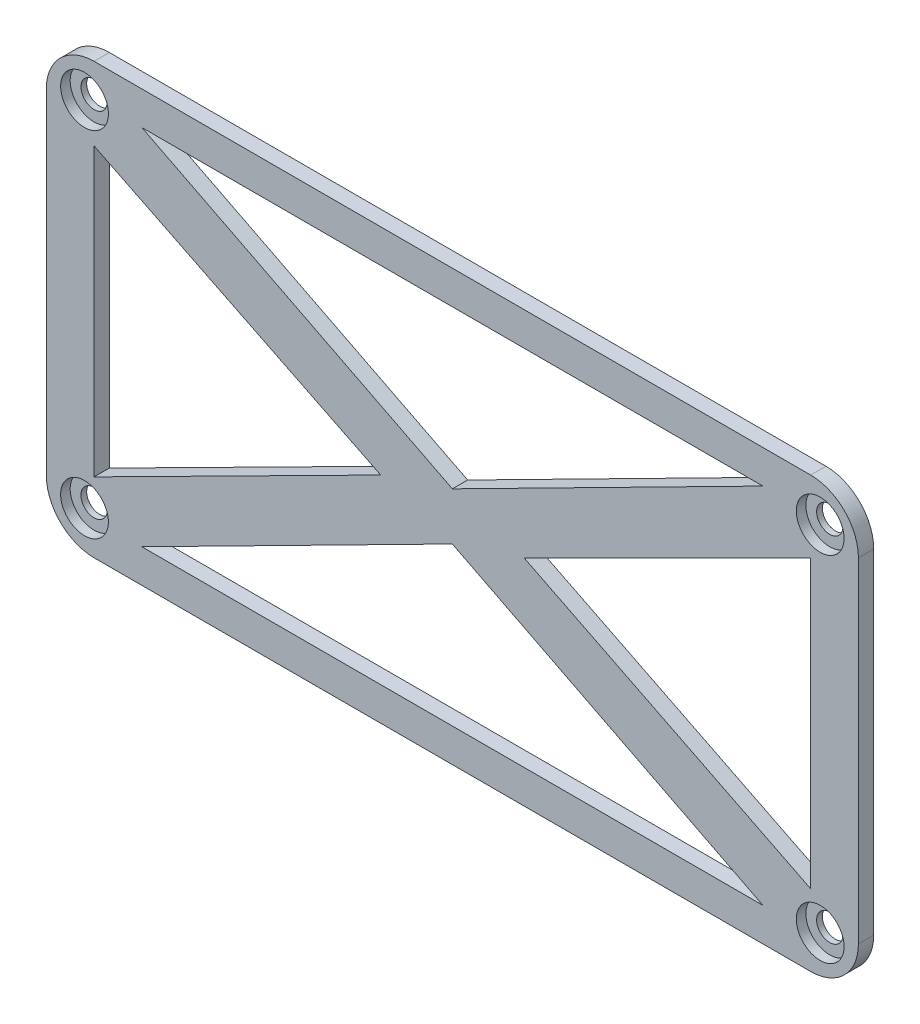
ISO-10303-21;
HEADER;
FILE_DESCRIPTION(('STEP AP214'),'2;1');
FILE_NAME('part.step','',(''),(''),'','','');
FILE_SCHEMA(('AUTOMOTIVE_DESIGN { 1 0 10303 214 1 1 1 1 }'));
ENDSEC;
DATA;
#1=APPLICATION_CONTEXT('core data for automotive mechanical design processes');
#2=APPLICATION_PROTOCOL_DEFINITION('international standard','automotive_design',2000,#1);
#3=PRODUCT_CONTEXT('',#1,'mechanical');
#4=PRODUCT('Part','Part','',(#3));
#5=PRODUCT_RELATED_PRODUCT_CATEGORY('part','',(#4));
#6=PRODUCT_DEFINITION_FORMATION('','',#4);
#7=PRODUCT_DEFINITION_CONTEXT('part definition',#1,'design');
#8=PRODUCT_DEFINITION('design','',#6,#7);
#9=PRODUCT_DEFINITION_SHAPE('','',#8);
#10=(LENGTH_UNIT() NAMED_UNIT(*) SI_UNIT(.MILLI.,.METRE.));
#11=(NAMED_UNIT(*) PLANE_ANGLE_UNIT() SI_UNIT($,.RADIAN.));
#12=(NAMED_UNIT(*) SI_UNIT($,.STERADIAN.) SOLID_ANGLE_UNIT());
#13=UNCERTAINTY_MEASURE_WITH_UNIT(LENGTH_MEASURE(1.E-05),#10,'distance_accuracy_value','');
#14=(GEOMETRIC_REPRESENTATION_CONTEXT(3) GLOBAL_UNCERTAINTY_ASSIGNED_CONTEXT((#13)) GLOBAL_UNIT_ASSIGNED_CONTEXT((#10,
#11,#12)) REPRESENTATION_CONTEXT('',''));
#15=CARTESIAN_POINT('',(0.,0.,0.));
#16=DIRECTION('',(0.,0.,1.));
#17=DIRECTION('',(1.,0.,0.));
#18=AXIS2_PLACEMENT_3D('',#15,#16,#17);
#19=CARTESIAN_POINT('',(-74.5741165309511,37.4873903075342,42.2));
#20=DIRECTION('',(0.,0.,-1.));
#21=DIRECTION('',(-1.,0.,0.));
#22=AXIS2_PLACEMENT_3D('',#19,#20,#21);
#23=CYLINDRICAL_SURFACE('',#22,2.75000000000001);
#24=CARTESIAN_POINT('',(-74.5741165309511,37.4873903075342,0.));
#25=DIRECTION('',(0.,0.,1.));
#26=DIRECTION('',(1.,0.,0.));
#27=AXIS2_PLACEMENT_3D('',#24,#25,#26);
#28=CIRCLE('',#27,2.75000000000001);
#29=CARTESIAN_POINT('',(-71.8241165309511,37.4873903075342,0.));
#30=VERTEX_POINT('',#29);
#31=EDGE_CURVE('E306',#30,#30,#28,.F.);
#32=ORIENTED_EDGE('',*,*,#31,.T.);
#33=EDGE_LOOP('',(#32));
#34=FACE_BOUND('',#33,.T.);
#35=CARTESIAN_POINT('',(-74.5741165309511,37.4873903075342,1.2));
#36=DIRECTION('',(0.,0.,1.));
#37=DIRECTION('',(1.,0.,0.));
#38=AXIS2_PLACEMENT_3D('',#35,#36,#37);
#39=CIRCLE('',#38,2.75000000000001);
#40=CARTESIAN_POINT('',(-71.8241165309511,37.4873903075342,1.2));
#41=VERTEX_POINT('',#40);
#42=EDGE_CURVE('E43',#41,#41,#39,.T.);
#43=ORIENTED_EDGE('',*,*,#42,.T.);
#44=EDGE_LOOP('',(#43));
#45=FACE_BOUND('',#44,.T.);
#46=ADVANCED_FACE('F39',(#34,#45),#23,.F.);
#47=CARTESIAN_POINT('',(-74.5741165309511,-36.5126096924658,42.2));
#48=DIRECTION('',(0.,0.,-1.));
#49=DIRECTION('',(-1.,0.,0.));
#50=AXIS2_PLACEMENT_3D('',#47,#48,#49);
#51=CYLINDRICAL_SURFACE('',#50,2.75000000000001);
#52=CARTESIAN_POINT('',(-74.5741165309511,-36.5126096924658,0.));
#53=DIRECTION('',(0.,0.,1.));
#54=DIRECTION('',(1.,0.,0.));
#55=AXIS2_PLACEMENT_3D('',#52,#53,#54);
#56=CIRCLE('',#55,2.75000000000001);
#57=CARTESIAN_POINT('',(-71.8241165309511,-36.5126096924658,0.));
#58=VERTEX_POINT('',#57);
#59=EDGE_CURVE('E233',#58,#58,#56,.F.);
#60=ORIENTED_EDGE('',*,*,#59,.T.);
#61=EDGE_LOOP('',(#60));
#62=FACE_BOUND('',#61,.T.);
#63=CARTESIAN_POINT('',(-74.5741165309511,-36.5126096924658,1.2));
#64=DIRECTION('',(0.,0.,1.));
#65=DIRECTION('',(1.,0.,0.));
#66=AXIS2_PLACEMENT_3D('',#63,#64,#65);
#67=CIRCLE('',#66,2.75000000000001);
#68=CARTESIAN_POINT('',(-71.8241165309511,-36.5126096924658,1.2));
#69=VERTEX_POINT('',#68);
#70=EDGE_CURVE('E259',#69,#69,#67,.T.);
#71=ORIENTED_EDGE('',*,*,#70,.T.);
#72=EDGE_LOOP('',(#71));
#73=FACE_BOUND('',#72,.T.);
#74=ADVANCED_FACE('F489',(#62,#73),#51,.F.);
#75=CARTESIAN_POINT('',(79.4258834690489,37.4873903075342,42.2));
#76=DIRECTION('',(0.,0.,-1.));
#77=DIRECTION('',(-1.,0.,0.));
#78=AXIS2_PLACEMENT_3D('',#75,#76,#77);
#79=CYLINDRICAL_SURFACE('',#78,2.75000000000001);
#80=CARTESIAN_POINT('',(79.4258834690489,37.4873903075342,0.));
#81=DIRECTION('',(0.,0.,1.));
#82=DIRECTION('',(1.,0.,0.));
#83=AXIS2_PLACEMENT_3D('',#80,#81,#82);
#84=CIRCLE('',#83,2.75000000000001);
#85=CARTESIAN_POINT('',(82.1758834690489,37.4873903075342,0.));
#86=VERTEX_POINT('',#85);
#87=EDGE_CURVE('E237',#86,#86,#84,.F.);
#88=ORIENTED_EDGE('',*,*,#87,.T.);
#89=EDGE_LOOP('',(#88));
#90=FACE_BOUND('',#89,.T.);
#91=CARTESIAN_POINT('',(79.4258834690489,37.4873903075342,1.2));
#92=DIRECTION('',(0.,0.,1.));
#93=DIRECTION('',(1.,0.,0.));
#94=AXIS2_PLACEMENT_3D('',#91,#92,#93);
#95=CIRCLE('',#94,2.75000000000001);
#96=CARTESIAN_POINT('',(82.1758834690489,37.4873903075342,1.2));
#97=VERTEX_POINT('',#96);
#98=EDGE_CURVE('E255',#97,#97,#95,.T.);
#99=ORIENTED_EDGE('',*,*,#98,.T.);
#100=EDGE_LOOP('',(#99));
#101=FACE_BOUND('',#100,.T.);
#102=ADVANCED_FACE('F493',(#90,#101),#79,.F.);
#103=CARTESIAN_POINT('',(79.4258834690489,-36.5126096924658,42.2));
#104=DIRECTION('',(0.,0.,-1.));
#105=DIRECTION('',(-1.,0.,0.));
#106=AXIS2_PLACEMENT_3D('',#103,#104,#105);
#107=CYLINDRICAL_SURFACE('',#106,2.75000000000001);
#108=CARTESIAN_POINT('',(79.4258834690489,-36.5126096924658,0.));
#109=DIRECTION('',(0.,0.,1.));
#110=DIRECTION('',(1.,0.,0.));
#111=AXIS2_PLACEMENT_3D('',#108,#109,#110);
#112=CIRCLE('',#111,2.75000000000001);
#113=CARTESIAN_POINT('',(82.1758834690489,-36.5126096924658,0.));
#114=VERTEX_POINT('',#113);
#115=EDGE_CURVE('E242',#114,#114,#112,.F.);
#116=ORIENTED_EDGE('',*,*,#115,.T.);
#117=EDGE_LOOP('',(#116));
#118=FACE_BOUND('',#117,.T.);
#119=CARTESIAN_POINT('',(79.4258834690489,-36.5126096924658,1.2));
#120=DIRECTION('',(0.,0.,1.));
#121=DIRECTION('',(1.,0.,0.));
#122=AXIS2_PLACEMENT_3D('',#119,#120,#121);
#123=CIRCLE('',#122,2.75000000000001);
#124=CARTESIAN_POINT('',(82.1758834690489,-36.5126096924658,1.2));
#125=VERTEX_POINT('',#124);
#126=EDGE_CURVE('E251',#125,#125,#123,.T.);
#127=ORIENTED_EDGE('',*,*,#126,.T.);
#128=EDGE_LOOP('',(#127));
#129=FACE_BOUND('',#128,.T.);
#130=ADVANCED_FACE('F498',(#118,#129),#107,.F.);
#131=CARTESIAN_POINT('',(-72.5741165309511,35.4873903075342,3.2));
#132=DIRECTION('',(0.,0.,-1.));
#133=DIRECTION('',(-1.,0.,0.));
#134=AXIS2_PLACEMENT_3D('',#131,#132,#133);
#135=CYLINDRICAL_SURFACE('',#134,10.);
#136=CARTESIAN_POINT('',(-72.5741165309511,35.4873903075342,0.));
#137=DIRECTION('',(0.,0.,1.));
#138=DIRECTION('',(1.,0.,0.));
#139=AXIS2_PLACEMENT_3D('',#136,#137,#138);
#140=CIRCLE('',#139,10.);
#141=CARTESIAN_POINT('',(-72.5741165309511,45.4873903075342,0.));
#142=VERTEX_POINT('',#141);
#143=CARTESIAN_POINT('',(-82.5741165309511,35.4873903075342,0.));
#144=VERTEX_POINT('',#143);
#145=EDGE_CURVE('E350',#142,#144,#140,.T.);
#146=ORIENTED_EDGE('',*,*,#145,.T.);
#147=DIRECTION('',(0.,0.,-1.));
#148=VECTOR('',#147,1.);
#149=CARTESIAN_POINT('',(-82.5741165309511,35.4873903075342,3.2));
#150=LINE('',#149,#148);
#151=CARTESIAN_POINT('',(-82.5741165309511,35.4873903075342,3.2));
#152=VERTEX_POINT('',#151);
#153=EDGE_CURVE('E191',#152,#144,#150,.T.);
#154=ORIENTED_EDGE('',*,*,#153,.F.);
#155=CARTESIAN_POINT('',(-72.5741165309511,35.4873903075342,3.2));
#156=DIRECTION('',(0.,0.,1.));
#157=DIRECTION('',(1.,0.,0.));
#158=AXIS2_PLACEMENT_3D('',#155,#156,#157);
#159=CIRCLE('',#158,10.);
#160=CARTESIAN_POINT('',(-72.5741165309511,45.4873903075342,3.2));
#161=VERTEX_POINT('',#160);
#162=EDGE_CURVE('E351',#161,#152,#159,.T.);
#163=ORIENTED_EDGE('',*,*,#162,.F.);
#164=DIRECTION('',(0.,0.,-1.));
#165=VECTOR('',#164,1.);
#166=CARTESIAN_POINT('',(-72.5741165309511,45.4873903075342,3.2));
#167=LINE('',#166,#165);
#168=EDGE_CURVE('E377',#161,#142,#167,.T.);
#169=ORIENTED_EDGE('',*,*,#168,.T.);
#170=EDGE_LOOP('',(#146,#154,#163,#169));
#171=FACE_BOUND('',#170,.T.);
#172=ADVANCED_FACE('F41',(#171),#135,.T.);
#173=CARTESIAN_POINT('',(-82.5741165309511,35.4873903075342,3.2));
#174=DIRECTION('',(1.,0.,0.));
#175=DIRECTION('',(0.,0.,-1.));
#176=AXIS2_PLACEMENT_3D('',#173,#174,#175);
#177=PLANE('',#176);
#178=DIRECTION('',(0.,-1.,0.));
#179=VECTOR('',#178,1.);
#180=CARTESIAN_POINT('',(-82.5741165309511,35.4873903075342,0.));
#181=LINE('',#180,#179);
#182=CARTESIAN_POINT('',(-82.5741165309511,-34.5126096924658,0.));
#183=VERTEX_POINT('',#182);
#184=EDGE_CURVE('E381',#144,#183,#181,.T.);
#185=ORIENTED_EDGE('',*,*,#184,.T.);
#186=DIRECTION('',(0.,0.,-1.));
#187=VECTOR('',#186,1.);
#188=CARTESIAN_POINT('',(-82.5741165309511,-34.5126096924658,3.2));
#189=LINE('',#188,#187);
#190=CARTESIAN_POINT('',(-82.5741165309511,-34.5126096924658,3.2));
#191=VERTEX_POINT('',#190);
#192=EDGE_CURVE('E424',#191,#183,#189,.T.);
#193=ORIENTED_EDGE('',*,*,#192,.F.);
#194=DIRECTION('',(0.,-1.,0.));
#195=VECTOR('',#194,1.);
#196=CARTESIAN_POINT('',(-82.5741165309511,35.4873903075342,3.2));
#197=LINE('',#196,#195);
#198=EDGE_CURVE('E355',#152,#191,#197,.T.);
#199=ORIENTED_EDGE('',*,*,#198,.F.);
#200=ORIENTED_EDGE('',*,*,#153,.T.);
#201=EDGE_LOOP('',(#185,#193,#199,#200));
#202=FACE_BOUND('',#201,.T.);
#203=ADVANCED_FACE('F476',(#202),#177,.F.);
#204=CARTESIAN_POINT('',(-72.5741165309511,-34.5126096924658,3.2));
#205=DIRECTION('',(0.,0.,-1.));
#206=DIRECTION('',(-1.,0.,0.));
#207=AXIS2_PLACEMENT_3D('',#204,#205,#206);
#208=CYLINDRICAL_SURFACE('',#207,9.99999999999999);
#209=CARTESIAN_POINT('',(-72.5741165309511,-34.5126096924658,0.));
#210=DIRECTION('',(0.,0.,1.));
#211=DIRECTION('',(-1.,0.,0.));
#212=AXIS2_PLACEMENT_3D('',#209,#210,#211);
#213=CIRCLE('',#212,9.99999999999999);
#214=CARTESIAN_POINT('',(-72.574116530951,-44.5126096924658,0.));
#215=VERTEX_POINT('',#214);
#216=EDGE_CURVE('E384',#183,#215,#213,.T.);
#217=ORIENTED_EDGE('',*,*,#216,.T.);
#218=DIRECTION('',(0.,0.,-1.));
#219=VECTOR('',#218,1.);
#220=CARTESIAN_POINT('',(-72.574116530951,-44.5126096924658,3.2));
#221=LINE('',#220,#219);
#222=CARTESIAN_POINT('',(-72.574116530951,-44.5126096924658,3.2));
#223=VERTEX_POINT('',#222);
#224=EDGE_CURVE('E420',#223,#215,#221,.T.);
#225=ORIENTED_EDGE('',*,*,#224,.F.);
#226=CARTESIAN_POINT('',(-72.5741165309511,-34.5126096924658,3.2));
#227=DIRECTION('',(0.,0.,1.));
#228=DIRECTION('',(-1.,0.,0.));
#229=AXIS2_PLACEMENT_3D('',#226,#227,#228);
#230=CIRCLE('',#229,9.99999999999999);
#231=EDGE_CURVE('E359',#191,#223,#230,.T.);
#232=ORIENTED_EDGE('',*,*,#231,.F.);
#233=ORIENTED_EDGE('',*,*,#192,.T.);
#234=EDGE_LOOP('',(#217,#225,#232,#233));
#235=FACE_BOUND('',#234,.T.);
#236=ADVANCED_FACE('F472',(#235),#208,.T.);
#237=CARTESIAN_POINT('',(-72.574116530951,-44.5126096924658,3.2));
#238=DIRECTION('',(0.,1.,0.));
#239=DIRECTION('',(0.,0.,1.));
#240=AXIS2_PLACEMENT_3D('',#237,#238,#239);
#241=PLANE('',#240);
#242=DIRECTION('',(1.,0.,0.));
#243=VECTOR('',#242,1.);
#244=CARTESIAN_POINT('',(-72.574116530951,-44.5126096924658,0.));
#245=LINE('',#244,#243);
#246=CARTESIAN_POINT('',(77.425883469049,-44.5126096924658,0.));
#247=VERTEX_POINT('',#246);
#248=EDGE_CURVE('E387',#215,#247,#245,.T.);
#249=ORIENTED_EDGE('',*,*,#248,.T.);
#250=DIRECTION('',(0.,0.,-1.));
#251=VECTOR('',#250,1.);
#252=CARTESIAN_POINT('',(77.425883469049,-44.5126096924658,3.2));
#253=LINE('',#252,#251);
#254=CARTESIAN_POINT('',(77.425883469049,-44.5126096924658,3.2));
#255=VERTEX_POINT('',#254);
#256=EDGE_CURVE('E416',#255,#247,#253,.T.);
#257=ORIENTED_EDGE('',*,*,#256,.F.);
#258=DIRECTION('',(1.,0.,0.));
#259=VECTOR('',#258,1.);
#260=CARTESIAN_POINT('',(-72.574116530951,-44.5126096924658,3.2));
#261=LINE('',#260,#259);
#262=EDGE_CURVE('E362',#223,#255,#261,.T.);
#263=ORIENTED_EDGE('',*,*,#262,.F.);
#264=ORIENTED_EDGE('',*,*,#224,.T.);
#265=EDGE_LOOP('',(#249,#257,#263,#264));
#266=FACE_BOUND('',#265,.T.);
#267=ADVANCED_FACE('F469',(#266),#241,.F.);
#268=CARTESIAN_POINT('',(77.425883469049,-34.5126096924658,3.2));
#269=DIRECTION('',(0.,0.,-1.));
#270=DIRECTION('',(-1.,0.,0.));
#271=AXIS2_PLACEMENT_3D('',#268,#269,#270);
#272=CYLINDRICAL_SURFACE('',#271,9.99999999999999);
#273=CARTESIAN_POINT('',(77.425883469049,-34.5126096924658,0.));
#274=DIRECTION('',(0.,0.,1.));
#275=DIRECTION('',(-1.,0.,0.));
#276=AXIS2_PLACEMENT_3D('',#273,#274,#275);
#277=CIRCLE('',#276,9.99999999999999);
#278=CARTESIAN_POINT('',(87.425883469049,-34.5126096924658,0.));
#279=VERTEX_POINT('',#278);
#280=EDGE_CURVE('E390',#247,#279,#277,.T.);
#281=ORIENTED_EDGE('',*,*,#280,.T.);
#282=DIRECTION('',(0.,0.,-1.));
#283=VECTOR('',#282,1.);
#284=CARTESIAN_POINT('',(87.425883469049,-34.5126096924658,3.2));
#285=LINE('',#284,#283);
#286=CARTESIAN_POINT('',(87.425883469049,-34.5126096924658,3.2));
#287=VERTEX_POINT('',#286);
#288=EDGE_CURVE('E412',#287,#279,#285,.T.);
#289=ORIENTED_EDGE('',*,*,#288,.F.);
#290=CARTESIAN_POINT('',(77.425883469049,-34.5126096924658,3.2));
#291=DIRECTION('',(0.,0.,1.));
#292=DIRECTION('',(-1.,0.,0.));
#293=AXIS2_PLACEMENT_3D('',#290,#291,#292);
#294=CIRCLE('',#293,9.99999999999999);
#295=EDGE_CURVE('E365',#255,#287,#294,.T.);
#296=ORIENTED_EDGE('',*,*,#295,.F.);
#297=ORIENTED_EDGE('',*,*,#256,.T.);
#298=EDGE_LOOP('',(#281,#289,#296,#297));
#299=FACE_BOUND('',#298,.T.);
#300=ADVANCED_FACE('F465',(#299),#272,.T.);
#301=CARTESIAN_POINT('',(87.425883469049,35.4873903075342,3.2));
#302=DIRECTION('',(-1.,0.,0.));
#303=DIRECTION('',(0.,0.,1.));
#304=AXIS2_PLACEMENT_3D('',#301,#302,#303);
#305=PLANE('',#304);
#306=DIRECTION('',(0.,1.,0.));
#307=VECTOR('',#306,1.);
#308=CARTESIAN_POINT('',(87.425883469049,35.4873903075342,0.));
#309=LINE('',#308,#307);
#310=CARTESIAN_POINT('',(87.425883469049,35.4873903075342,0.));
#311=VERTEX_POINT('',#310);
#312=EDGE_CURVE('E393',#279,#311,#309,.T.);
#313=ORIENTED_EDGE('',*,*,#312,.T.);
#314=DIRECTION('',(0.,0.,-1.));
#315=VECTOR('',#314,1.);
#316=CARTESIAN_POINT('',(87.425883469049,35.4873903075342,3.2));
#317=LINE('',#316,#315);
#318=CARTESIAN_POINT('',(87.425883469049,35.4873903075342,3.2));
#319=VERTEX_POINT('',#318);
#320=EDGE_CURVE('E408',#319,#311,#317,.T.);
#321=ORIENTED_EDGE('',*,*,#320,.F.);
#322=DIRECTION('',(0.,1.,0.));
#323=VECTOR('',#322,1.);
#324=CARTESIAN_POINT('',(87.425883469049,35.4873903075342,3.2));
#325=LINE('',#324,#323);
#326=EDGE_CURVE('E368',#287,#319,#325,.T.);
#327=ORIENTED_EDGE('',*,*,#326,.F.);
#328=ORIENTED_EDGE('',*,*,#288,.T.);
#329=EDGE_LOOP('',(#313,#321,#327,#328));
#330=FACE_BOUND('',#329,.T.);
#331=ADVANCED_FACE('F460',(#330),#305,.F.);
#332=CARTESIAN_POINT('',(77.425883469049,35.4873903075342,3.2));
#333=DIRECTION('',(0.,0.,-1.));
#334=DIRECTION('',(-1.,0.,0.));
#335=AXIS2_PLACEMENT_3D('',#332,#333,#334);
#336=CYLINDRICAL_SURFACE('',#335,10.);
#337=CARTESIAN_POINT('',(77.425883469049,35.4873903075342,0.));
#338=DIRECTION('',(0.,0.,1.));
#339=DIRECTION('',(1.,0.,0.));
#340=AXIS2_PLACEMENT_3D('',#337,#338,#339);
#341=CIRCLE('',#340,10.);
#342=CARTESIAN_POINT('',(77.425883469049,45.4873903075342,0.));
#343=VERTEX_POINT('',#342);
#344=EDGE_CURVE('E396',#311,#343,#341,.T.);
#345=ORIENTED_EDGE('',*,*,#344,.T.);
#346=DIRECTION('',(0.,0.,-1.));
#347=VECTOR('',#346,1.);
#348=CARTESIAN_POINT('',(77.425883469049,45.4873903075342,3.2));
#349=LINE('',#348,#347);
#350=CARTESIAN_POINT('',(77.425883469049,45.4873903075342,3.2));
#351=VERTEX_POINT('',#350);
#352=EDGE_CURVE('E404',#351,#343,#349,.T.);
#353=ORIENTED_EDGE('',*,*,#352,.F.);
#354=CARTESIAN_POINT('',(77.425883469049,35.4873903075342,3.2));
#355=DIRECTION('',(0.,0.,1.));
#356=DIRECTION('',(1.,0.,0.));
#357=AXIS2_PLACEMENT_3D('',#354,#355,#356);
#358=CIRCLE('',#357,10.);
#359=EDGE_CURVE('E371',#319,#351,#358,.T.);
#360=ORIENTED_EDGE('',*,*,#359,.F.);
#361=ORIENTED_EDGE('',*,*,#320,.T.);
#362=EDGE_LOOP('',(#345,#353,#360,#361));
#363=FACE_BOUND('',#362,.T.);
#364=ADVANCED_FACE('F454',(#363),#336,.T.);
#365=CARTESIAN_POINT('',(-72.5741165309511,45.4873903075342,3.2));
#366=DIRECTION('',(0.,-1.,0.));
#367=DIRECTION('',(1.,0.,0.));
#368=AXIS2_PLACEMENT_3D('',#365,#366,#367);
#369=PLANE('',#368);
#370=DIRECTION('',(-1.,0.,0.));
#371=VECTOR('',#370,1.);
#372=CARTESIAN_POINT('',(-72.5741165309511,45.4873903075342,0.));
#373=LINE('',#372,#371);
#374=EDGE_CURVE('E356',#343,#142,#373,.T.);
#375=ORIENTED_EDGE('',*,*,#374,.T.);
#376=ORIENTED_EDGE('',*,*,#168,.F.);
#377=DIRECTION('',(-1.,0.,0.));
#378=VECTOR('',#377,1.);
#379=CARTESIAN_POINT('',(-72.5741165309511,45.4873903075342,3.2));
#380=LINE('',#379,#378);
#381=EDGE_CURVE('E374',#351,#161,#380,.T.);
#382=ORIENTED_EDGE('',*,*,#381,.F.);
#383=ORIENTED_EDGE('',*,*,#352,.T.);
#384=EDGE_LOOP('',(#375,#376,#382,#383));
#385=FACE_BOUND('',#384,.T.);
#386=ADVANCED_FACE('F450',(#385),#369,.F.);
#387=CARTESIAN_POINT('',(-72.5741165309511,35.4873903075342,3.2));
#388=DIRECTION('',(0.,0.,1.));
#389=DIRECTION('',(1.,0.,0.));
#390=AXIS2_PLACEMENT_3D('',#387,#388,#389);
#391=PLANE('',#390);
#392=CARTESIAN_POINT('',(-74.5741165309511,-36.5126096924658,3.2));
#393=DIRECTION('',(0.,0.,1.));
#394=DIRECTION('',(1.,0.,0.));
#395=AXIS2_PLACEMENT_3D('',#392,#393,#394);
#396=CIRCLE('',#395,5.00000000000001);
#397=CARTESIAN_POINT('',(-69.5741165309511,-36.5126096924658,3.2));
#398=VERTEX_POINT('',#397);
#399=EDGE_CURVE('E604',#398,#398,#396,.T.);
#400=ORIENTED_EDGE('',*,*,#399,.F.);
#401=EDGE_LOOP('',(#400));
#402=FACE_BOUND('',#401,.T.);
#403=CARTESIAN_POINT('',(79.4258834690489,-36.5126096924658,3.2));
#404=DIRECTION('',(0.,0.,1.));
#405=DIRECTION('',(1.,0.,0.));
#406=AXIS2_PLACEMENT_3D('',#403,#404,#405);
#407=CIRCLE('',#406,5.00000000000001);
#408=CARTESIAN_POINT('',(84.4258834690489,-36.5126096924658,3.2));
#409=VERTEX_POINT('',#408);
#410=EDGE_CURVE('E596',#409,#409,#407,.T.);
#411=ORIENTED_EDGE('',*,*,#410,.F.);
#412=EDGE_LOOP('',(#411));
#413=FACE_BOUND('',#412,.T.);
#414=CARTESIAN_POINT('',(79.4258834690489,37.4873903075342,3.2));
#415=DIRECTION('',(0.,0.,1.));
#416=DIRECTION('',(1.,0.,0.));
#417=AXIS2_PLACEMENT_3D('',#414,#415,#416);
#418=CIRCLE('',#417,5.00000000000001);
#419=CARTESIAN_POINT('',(84.4258834690489,37.4873903075342,3.2));
#420=VERTEX_POINT('',#419);
#421=EDGE_CURVE('E584',#420,#420,#418,.T.);
#422=ORIENTED_EDGE('',*,*,#421,.F.);
#423=EDGE_LOOP('',(#422));
#424=FACE_BOUND('',#423,.T.);
#425=CARTESIAN_POINT('',(-74.5741165309511,37.4873903075342,3.2));
#426=DIRECTION('',(0.,0.,1.));
#427=DIRECTION('',(1.,0.,0.));
#428=AXIS2_PLACEMENT_3D('',#425,#426,#427);
#429=CIRCLE('',#428,5.00000000000001);
#430=CARTESIAN_POINT('',(-69.5741165309511,37.4873903075342,3.2));
#431=VERTEX_POINT('',#430);
#432=EDGE_CURVE('E276',#431,#431,#429,.T.);
#433=ORIENTED_EDGE('',*,*,#432,.F.);
#434=EDGE_LOOP('',(#433));
#435=FACE_BOUND('',#434,.T.);
#436=DIRECTION('',(0.891666769258181,0.452692359777231,0.));
#437=VECTOR('',#436,1.);
#438=CARTESIAN_POINT('',(-41.0583092294832,-26.5891998317206,3.2));
#439=LINE('',#438,#437);
#440=CARTESIAN_POINT('',(-62.5741165309511,-37.5126096924658,3.2));
#441=VERTEX_POINT('',#440);
#442=CARTESIAN_POINT('',(2.42588346904892,-4.51260969246582,3.2));
#443=VERTEX_POINT('',#442);
#444=EDGE_CURVE('E342',#441,#443,#439,.T.);
#445=ORIENTED_EDGE('',*,*,#444,.T.);
#446=DIRECTION('',(0.891666769258181,-0.45269235977723,0.));
#447=VECTOR('',#446,1.);
#448=CARTESIAN_POINT('',(-73.3503679423173,33.9584102548432,3.2));
#449=LINE('',#448,#447);
#450=CARTESIAN_POINT('',(67.4258834690489,-37.5126096924658,3.2));
#451=VERTEX_POINT('',#450);
#452=EDGE_CURVE('E346',#443,#451,#449,.T.);
#453=ORIENTED_EDGE('',*,*,#452,.T.);
#454=DIRECTION('',(-1.,0.,0.));
#455=VECTOR('',#454,1.);
#456=CARTESIAN_POINT('',(-72.5741165309511,-37.5126096924658,3.2));
#457=LINE('',#456,#455);
#458=EDGE_CURVE('E246',#451,#441,#457,.T.);
#459=ORIENTED_EDGE('',*,*,#458,.T.);
#460=EDGE_LOOP('',(#445,#453,#459));
#461=FACE_BOUND('',#460,.T.);
#462=DIRECTION('',(0.,-1.,0.));
#463=VECTOR('',#462,1.);
#464=CARTESIAN_POINT('',(77.4258834690489,35.4873903075342,3.2));
#465=LINE('',#464,#463);
#466=CARTESIAN_POINT('',(77.4258834690489,30.4873903075342,3.2));
#467=VERTEX_POINT('',#466);
#468=CARTESIAN_POINT('',(77.425883469049,-29.5126096924658,3.2));
#469=VERTEX_POINT('',#468);
#470=EDGE_CURVE('E332',#467,#469,#465,.T.);
#471=ORIENTED_EDGE('',*,*,#470,.T.);
#472=DIRECTION('',(-0.894427190999916,0.447213595499958,0.));
#473=VECTOR('',#472,1.);
#474=CARTESIAN_POINT('',(-68.5741165309511,43.4873903075342,3.2));
#475=LINE('',#474,#473);
#476=CARTESIAN_POINT('',(17.4258834690489,0.487390307534183,3.2));
#477=VERTEX_POINT('',#476);
#478=EDGE_CURVE('E238',#469,#477,#475,.T.);
#479=ORIENTED_EDGE('',*,*,#478,.T.);
#480=DIRECTION('',(0.894427190999916,0.447213595499958,0.));
#481=VECTOR('',#480,1.);
#482=CARTESIAN_POINT('',(-40.5741165309511,-28.5126096924658,3.2));
#483=LINE('',#482,#481);
#484=EDGE_CURVE('E328',#477,#467,#483,.T.);
#485=ORIENTED_EDGE('',*,*,#484,.T.);
#486=EDGE_LOOP('',(#471,#479,#485));
#487=FACE_BOUND('',#486,.T.);
#488=DIRECTION('',(-0.892447356199141,-0.451151544841824,0.));
#489=VECTOR('',#488,1.);
#490=CARTESIAN_POINT('',(-46.2698384257877,-16.5465298243597,3.2));
#491=LINE('',#490,#489);
#492=CARTESIAN_POINT('',(-12.5741165309511,0.487390307534183,3.2));
#493=VERTEX_POINT('',#492);
#494=CARTESIAN_POINT('',(-72.5741165309511,-29.843914393501,3.2));
#495=VERTEX_POINT('',#494);
#496=EDGE_CURVE('E320',#493,#495,#491,.T.);
#497=ORIENTED_EDGE('',*,*,#496,.T.);
#498=DIRECTION('',(0.,1.,0.));
#499=VECTOR('',#498,1.);
#500=CARTESIAN_POINT('',(-72.5741165309511,35.4873903075342,3.2));
#501=LINE('',#500,#499);
#502=CARTESIAN_POINT('',(-72.5741165309511,30.156085606499,3.2));
#503=VERTEX_POINT('',#502);
#504=EDGE_CURVE('E324',#495,#503,#501,.T.);
#505=ORIENTED_EDGE('',*,*,#504,.T.);
#506=DIRECTION('',(0.896398298935638,-0.443249466627196,0.));
#507=VECTOR('',#506,1.);
#508=CARTESIAN_POINT('',(-74.6923935271396,31.2035275191444,3.2));
#509=LINE('',#508,#507);
#510=EDGE_CURVE('E316',#503,#493,#509,.T.);
#511=ORIENTED_EDGE('',*,*,#510,.T.);
#512=EDGE_LOOP('',(#497,#505,#511));
#513=FACE_BOUND('',#512,.T.);
#514=DIRECTION('',(-0.891666769258181,0.45269235977723,0.));
#515=VECTOR('',#514,1.);
#516=CARTESIAN_POINT('',(-69.313860603213,41.9091065288364,3.2));
#517=LINE('',#516,#515);
#518=CARTESIAN_POINT('',(2.42588346904894,5.48739030753417,3.2));
#519=VERTEX_POINT('',#518);
#520=CARTESIAN_POINT('',(-62.5741165309511,38.4873903075342,3.2));
#521=VERTEX_POINT('',#520);
#522=EDGE_CURVE('E198',#519,#521,#517,.T.);
#523=ORIENTED_EDGE('',*,*,#522,.T.);
#524=DIRECTION('',(1.,0.,0.));
#525=VECTOR('',#524,1.);
#526=CARTESIAN_POINT('',(-72.5741165309511,38.4873903075342,3.2));
#527=LINE('',#526,#525);
#528=CARTESIAN_POINT('',(67.4258834690489,38.4873903075342,3.2));
#529=VERTEX_POINT('',#528);
#530=EDGE_CURVE('E312',#521,#529,#527,.T.);
#531=ORIENTED_EDGE('',*,*,#530,.T.);
#532=DIRECTION('',(-0.891666769258181,-0.45269235977723,0.));
#533=VECTOR('',#532,1.);
#534=CARTESIAN_POINT('',(-45.0948165685875,-18.6385035577274,3.2));
#535=LINE('',#534,#533);
#536=EDGE_CURVE('E307',#529,#519,#535,.T.);
#537=ORIENTED_EDGE('',*,*,#536,.T.);
#538=EDGE_LOOP('',(#523,#531,#537));
#539=FACE_BOUND('',#538,.T.);
#540=ORIENTED_EDGE('',*,*,#162,.T.);
#541=ORIENTED_EDGE('',*,*,#198,.T.);
#542=ORIENTED_EDGE('',*,*,#231,.T.);
#543=ORIENTED_EDGE('',*,*,#262,.T.);
#544=ORIENTED_EDGE('',*,*,#295,.T.);
#545=ORIENTED_EDGE('',*,*,#326,.T.);
#546=ORIENTED_EDGE('',*,*,#359,.T.);
#547=ORIENTED_EDGE('',*,*,#381,.T.);
#548=EDGE_LOOP('',(#540,#541,#542,#543,#544,#545,#546,#547));
#549=FACE_BOUND('',#548,.T.);
#550=ADVANCED_FACE('F437',(#402,#413,#424,#435,#461,#487,#513,#539,#549),#391,.T.);
#551=CARTESIAN_POINT('',(-72.5741165309511,35.4873903075342,0.));
#552=DIRECTION('',(0.,0.,1.));
#553=DIRECTION('',(1.,0.,0.));
#554=AXIS2_PLACEMENT_3D('',#551,#552,#553);
#555=PLANE('',#554);
#556=DIRECTION('',(0.891666769258181,-0.45269235977723,0.));
#557=VECTOR('',#556,1.);
#558=CARTESIAN_POINT('',(-73.3503679423173,33.9584102548432,0.));
#559=LINE('',#558,#557);
#560=CARTESIAN_POINT('',(2.42588346904892,-4.51260969246582,0.));
#561=VERTEX_POINT('',#560);
#562=CARTESIAN_POINT('',(67.4258834690489,-37.5126096924658,0.));
#563=VERTEX_POINT('',#562);
#564=EDGE_CURVE('E11',#561,#563,#559,.T.);
#565=ORIENTED_EDGE('',*,*,#564,.F.);
#566=DIRECTION('',(0.891666769258181,0.452692359777231,0.));
#567=VECTOR('',#566,1.);
#568=CARTESIAN_POINT('',(-41.0583092294832,-26.5891998317206,0.));
#569=LINE('',#568,#567);
#570=CARTESIAN_POINT('',(-62.5741165309511,-37.5126096924658,0.));
#571=VERTEX_POINT('',#570);
#572=EDGE_CURVE('E49',#571,#561,#569,.T.);
#573=ORIENTED_EDGE('',*,*,#572,.F.);
#574=DIRECTION('',(-1.,0.,0.));
#575=VECTOR('',#574,1.);
#576=CARTESIAN_POINT('',(-72.5741165309511,-37.5126096924658,0.));
#577=LINE('',#576,#575);
#578=EDGE_CURVE('E232',#563,#571,#577,.T.);
#579=ORIENTED_EDGE('',*,*,#578,.F.);
#580=EDGE_LOOP('',(#565,#573,#579));
#581=FACE_BOUND('',#580,.T.);
#582=ORIENTED_EDGE('',*,*,#115,.F.);
#583=EDGE_LOOP('',(#582));
#584=FACE_BOUND('',#583,.T.);
#585=ORIENTED_EDGE('',*,*,#87,.F.);
#586=EDGE_LOOP('',(#585));
#587=FACE_BOUND('',#586,.T.);
#588=ORIENTED_EDGE('',*,*,#59,.F.);
#589=EDGE_LOOP('',(#588));
#590=FACE_BOUND('',#589,.T.);
#591=DIRECTION('',(-0.894427190999916,0.447213595499958,0.));
#592=VECTOR('',#591,1.);
#593=CARTESIAN_POINT('',(-68.5741165309511,43.4873903075342,0.));
#594=LINE('',#593,#592);
#595=CARTESIAN_POINT('',(77.425883469049,-29.5126096924658,0.));
#596=VERTEX_POINT('',#595);
#597=CARTESIAN_POINT('',(17.4258834690489,0.487390307534172,0.));
#598=VERTEX_POINT('',#597);
#599=EDGE_CURVE('E228',#596,#598,#594,.T.);
#600=ORIENTED_EDGE('',*,*,#599,.F.);
#601=DIRECTION('',(0.,-1.,0.));
#602=VECTOR('',#601,1.);
#603=CARTESIAN_POINT('',(77.4258834690489,35.4873903075342,0.));
#604=LINE('',#603,#602);
#605=CARTESIAN_POINT('',(77.425883469049,30.4873903075342,0.));
#606=VERTEX_POINT('',#605);
#607=EDGE_CURVE('E225',#606,#596,#604,.T.);
#608=ORIENTED_EDGE('',*,*,#607,.F.);
#609=DIRECTION('',(0.894427190999916,0.447213595499958,0.));
#610=VECTOR('',#609,1.);
#611=CARTESIAN_POINT('',(-40.5741165309511,-28.5126096924658,0.));
#612=LINE('',#611,#610);
#613=EDGE_CURVE('E222',#598,#606,#612,.T.);
#614=ORIENTED_EDGE('',*,*,#613,.F.);
#615=EDGE_LOOP('',(#600,#608,#614));
#616=FACE_BOUND('',#615,.T.);
#617=DIRECTION('',(0.,1.,0.));
#618=VECTOR('',#617,1.);
#619=CARTESIAN_POINT('',(-72.5741165309511,35.4873903075342,0.));
#620=LINE('',#619,#618);
#621=CARTESIAN_POINT('',(-72.5741165309511,-29.843914393501,0.));
#622=VERTEX_POINT('',#621);
#623=CARTESIAN_POINT('',(-72.5741165309511,30.156085606499,0.));
#624=VERTEX_POINT('',#623);
#625=EDGE_CURVE('E218',#622,#624,#620,.T.);
#626=ORIENTED_EDGE('',*,*,#625,.F.);
#627=DIRECTION('',(-0.892447356199141,-0.451151544841824,0.));
#628=VECTOR('',#627,1.);
#629=CARTESIAN_POINT('',(-46.2698384257877,-16.5465298243597,0.));
#630=LINE('',#629,#628);
#631=CARTESIAN_POINT('',(-12.5741165309511,0.487390307534183,0.));
#632=VERTEX_POINT('',#631);
#633=EDGE_CURVE('E215',#632,#622,#630,.T.);
#634=ORIENTED_EDGE('',*,*,#633,.F.);
#635=DIRECTION('',(0.896398298935638,-0.443249466627196,0.));
#636=VECTOR('',#635,1.);
#637=CARTESIAN_POINT('',(-74.6923935271396,31.2035275191444,0.));
#638=LINE('',#637,#636);
#639=EDGE_CURVE('E209',#624,#632,#638,.T.);
#640=ORIENTED_EDGE('',*,*,#639,.F.);
#641=EDGE_LOOP('',(#626,#634,#640));
#642=FACE_BOUND('',#641,.T.);
#643=DIRECTION('',(1.,0.,0.));
#644=VECTOR('',#643,1.);
#645=CARTESIAN_POINT('',(-72.5741165309511,38.4873903075342,0.));
#646=LINE('',#645,#644);
#647=CARTESIAN_POINT('',(-62.5741165309511,38.4873903075342,0.));
#648=VERTEX_POINT('',#647);
#649=CARTESIAN_POINT('',(67.425883469049,38.4873903075342,0.));
#650=VERTEX_POINT('',#649);
#651=EDGE_CURVE('E205',#648,#650,#646,.T.);
#652=ORIENTED_EDGE('',*,*,#651,.F.);
#653=DIRECTION('',(-0.891666769258181,0.45269235977723,0.));
#654=VECTOR('',#653,1.);
#655=CARTESIAN_POINT('',(-69.313860603213,41.9091065288364,0.));
#656=LINE('',#655,#654);
#657=CARTESIAN_POINT('',(2.42588346904894,5.48739030753417,0.));
#658=VERTEX_POINT('',#657);
#659=EDGE_CURVE('E190',#658,#648,#656,.T.);
#660=ORIENTED_EDGE('',*,*,#659,.F.);
#661=DIRECTION('',(-0.891666769258181,-0.45269235977723,0.));
#662=VECTOR('',#661,1.);
#663=CARTESIAN_POINT('',(-45.0948165685875,-18.6385035577274,0.));
#664=LINE('',#663,#662);
#665=EDGE_CURVE('E178',#650,#658,#664,.T.);
#666=ORIENTED_EDGE('',*,*,#665,.F.);
#667=EDGE_LOOP('',(#652,#660,#666));
#668=FACE_BOUND('',#667,.T.);
#669=ORIENTED_EDGE('',*,*,#31,.F.);
#670=EDGE_LOOP('',(#669));
#671=FACE_BOUND('',#670,.T.);
#672=ORIENTED_EDGE('',*,*,#145,.F.);
#673=ORIENTED_EDGE('',*,*,#374,.F.);
#674=ORIENTED_EDGE('',*,*,#344,.F.);
#675=ORIENTED_EDGE('',*,*,#312,.F.);
#676=ORIENTED_EDGE('',*,*,#280,.F.);
#677=ORIENTED_EDGE('',*,*,#248,.F.);
#678=ORIENTED_EDGE('',*,*,#216,.F.);
#679=ORIENTED_EDGE('',*,*,#184,.F.);
#680=EDGE_LOOP('',(#672,#673,#674,#675,#676,#677,#678,#679));
#681=FACE_BOUND('',#680,.T.);
#682=ADVANCED_FACE('F203',(#581,#584,#587,#590,#616,#642,#668,#671,#681),#555,.F.);
#683=CARTESIAN_POINT('',(-62.5741165309511,38.4873903075342,42.2));
#684=DIRECTION('',(0.,-1.,0.));
#685=DIRECTION('',(0.,0.,-1.));
#686=AXIS2_PLACEMENT_3D('',#683,#684,#685);
#687=PLANE('',#686);
#688=DIRECTION('',(0.,0.,-1.));
#689=VECTOR('',#688,1.);
#690=CARTESIAN_POINT('',(-62.5741165309511,38.4873903075342,42.2));
#691=LINE('',#690,#689);
#692=EDGE_CURVE('E201',#521,#648,#691,.T.);
#693=ORIENTED_EDGE('',*,*,#692,.T.);
#694=ORIENTED_EDGE('',*,*,#651,.T.);
#695=DIRECTION('',(0.,0.,-1.));
#696=VECTOR('',#695,1.);
#697=CARTESIAN_POINT('',(67.4258834690489,38.4873903075342,42.2));
#698=LINE('',#697,#696);
#699=EDGE_CURVE('E184',#529,#650,#698,.T.);
#700=ORIENTED_EDGE('',*,*,#699,.F.);
#701=ORIENTED_EDGE('',*,*,#530,.F.);
#702=EDGE_LOOP('',(#693,#694,#700,#701));
#703=FACE_BOUND('',#702,.T.);
#704=ADVANCED_FACE('F436',(#703),#687,.T.);
#705=CARTESIAN_POINT('',(-62.5741165309511,38.4873903075342,42.2));
#706=DIRECTION('',(0.45269235977723,0.891666769258181,0.));
#707=DIRECTION('',(-0.891666769258181,0.45269235977723,0.));
#708=AXIS2_PLACEMENT_3D('',#705,#706,#707);
#709=PLANE('',#708);
#710=DIRECTION('',(0.,0.,-1.));
#711=VECTOR('',#710,1.);
#712=CARTESIAN_POINT('',(2.42588346904894,5.48739030753417,42.2));
#713=LINE('',#712,#711);
#714=EDGE_CURVE('E181',#519,#658,#713,.T.);
#715=ORIENTED_EDGE('',*,*,#714,.T.);
#716=ORIENTED_EDGE('',*,*,#659,.T.);
#717=ORIENTED_EDGE('',*,*,#692,.F.);
#718=ORIENTED_EDGE('',*,*,#522,.F.);
#719=EDGE_LOOP('',(#715,#716,#717,#718));
#720=FACE_BOUND('',#719,.T.);
#721=ADVANCED_FACE('F194',(#720),#709,.T.);
#722=CARTESIAN_POINT('',(67.4258834690489,38.4873903075342,42.2));
#723=DIRECTION('',(-0.45269235977723,0.891666769258181,0.));
#724=DIRECTION('',(-0.891666769258181,-0.45269235977723,0.));
#725=AXIS2_PLACEMENT_3D('',#722,#723,#724);
#726=PLANE('',#725);
#727=ORIENTED_EDGE('',*,*,#699,.T.);
#728=ORIENTED_EDGE('',*,*,#665,.T.);
#729=ORIENTED_EDGE('',*,*,#714,.F.);
#730=ORIENTED_EDGE('',*,*,#536,.F.);
#731=EDGE_LOOP('',(#727,#728,#729,#730));
#732=FACE_BOUND('',#731,.T.);
#733=ADVANCED_FACE('F180',(#732),#726,.T.);
#734=CARTESIAN_POINT('',(-72.5741165309511,30.156085606499,42.2));
#735=DIRECTION('',(1.,0.,0.));
#736=DIRECTION('',(0.,1.,0.));
#737=AXIS2_PLACEMENT_3D('',#734,#735,#736);
#738=PLANE('',#737);
#739=DIRECTION('',(0.,0.,-1.));
#740=VECTOR('',#739,1.);
#741=CARTESIAN_POINT('',(-72.5741165309511,-29.843914393501,42.2));
#742=LINE('',#741,#740);
#743=EDGE_CURVE('E293',#495,#622,#742,.T.);
#744=ORIENTED_EDGE('',*,*,#743,.T.);
#745=ORIENTED_EDGE('',*,*,#625,.T.);
#746=DIRECTION('',(0.,0.,-1.));
#747=VECTOR('',#746,1.);
#748=CARTESIAN_POINT('',(-72.5741165309511,30.156085606499,42.2));
#749=LINE('',#748,#747);
#750=EDGE_CURVE('E286',#503,#624,#749,.T.);
#751=ORIENTED_EDGE('',*,*,#750,.F.);
#752=ORIENTED_EDGE('',*,*,#504,.F.);
#753=EDGE_LOOP('',(#744,#745,#751,#752));
#754=FACE_BOUND('',#753,.T.);
#755=ADVANCED_FACE('F517',(#754),#738,.T.);
#756=CARTESIAN_POINT('',(-72.5741165309511,-29.843914393501,42.2));
#757=DIRECTION('',(-0.451151544841824,0.892447356199141,0.));
#758=DIRECTION('',(-0.892447356199141,-0.451151544841824,0.));
#759=AXIS2_PLACEMENT_3D('',#756,#757,#758);
#760=PLANE('',#759);
#761=DIRECTION('',(0.,0.,-1.));
#762=VECTOR('',#761,1.);
#763=CARTESIAN_POINT('',(-12.5741165309511,0.487390307534183,42.2));
#764=LINE('',#763,#762);
#765=EDGE_CURVE('E289',#493,#632,#764,.T.);
#766=ORIENTED_EDGE('',*,*,#765,.T.);
#767=ORIENTED_EDGE('',*,*,#633,.T.);
#768=ORIENTED_EDGE('',*,*,#743,.F.);
#769=ORIENTED_EDGE('',*,*,#496,.F.);
#770=EDGE_LOOP('',(#766,#767,#768,#769));
#771=FACE_BOUND('',#770,.T.);
#772=ADVANCED_FACE('F520',(#771),#760,.T.);
#773=CARTESIAN_POINT('',(-72.5741165309511,30.156085606499,42.2));
#774=DIRECTION('',(-0.443249466627196,-0.896398298935638,0.));
#775=DIRECTION('',(0.896398298935638,-0.443249466627196,0.));
#776=AXIS2_PLACEMENT_3D('',#773,#774,#775);
#777=PLANE('',#776);
#778=ORIENTED_EDGE('',*,*,#750,.T.);
#779=ORIENTED_EDGE('',*,*,#639,.T.);
#780=ORIENTED_EDGE('',*,*,#765,.F.);
#781=ORIENTED_EDGE('',*,*,#510,.F.);
#782=EDGE_LOOP('',(#778,#779,#780,#781));
#783=FACE_BOUND('',#782,.T.);
#784=ADVANCED_FACE('F524',(#783),#777,.T.);
#785=CARTESIAN_POINT('',(17.4258834690489,0.487390307534183,42.2));
#786=DIRECTION('',(0.447213595499958,0.894427190999916,0.));
#787=DIRECTION('',(-0.894427190999916,0.447213595499958,0.));
#788=AXIS2_PLACEMENT_3D('',#785,#786,#787);
#789=PLANE('',#788);
#790=DIRECTION('',(0.,0.,-1.));
#791=VECTOR('',#790,1.);
#792=CARTESIAN_POINT('',(77.425883469049,-29.5126096924658,42.2));
#793=LINE('',#792,#791);
#794=EDGE_CURVE('E273',#469,#596,#793,.T.);
#795=ORIENTED_EDGE('',*,*,#794,.T.);
#796=ORIENTED_EDGE('',*,*,#599,.T.);
#797=DIRECTION('',(0.,0.,-1.));
#798=VECTOR('',#797,1.);
#799=CARTESIAN_POINT('',(17.4258834690489,0.487390307534183,42.2));
#800=LINE('',#799,#798);
#801=EDGE_CURVE('E266',#477,#598,#800,.T.);
#802=ORIENTED_EDGE('',*,*,#801,.F.);
#803=ORIENTED_EDGE('',*,*,#478,.F.);
#804=EDGE_LOOP('',(#795,#796,#802,#803));
#805=FACE_BOUND('',#804,.T.);
#806=ADVANCED_FACE('F528',(#805),#789,.T.);
#807=CARTESIAN_POINT('',(77.425883469049,-29.5126096924658,42.2));
#808=DIRECTION('',(-1.,0.,0.));
#809=DIRECTION('',(0.,-1.,0.));
#810=AXIS2_PLACEMENT_3D('',#807,#808,#809);
#811=PLANE('',#810);
#812=DIRECTION('',(0.,0.,-1.));
#813=VECTOR('',#812,1.);
#814=CARTESIAN_POINT('',(77.425883469049,30.4873903075342,42.2));
#815=LINE('',#814,#813);
#816=EDGE_CURVE('E65',#467,#606,#815,.T.);
#817=ORIENTED_EDGE('',*,*,#816,.T.);
#818=ORIENTED_EDGE('',*,*,#607,.T.);
#819=ORIENTED_EDGE('',*,*,#794,.F.);
#820=ORIENTED_EDGE('',*,*,#470,.F.);
#821=EDGE_LOOP('',(#817,#818,#819,#820));
#822=FACE_BOUND('',#821,.T.);
#823=ADVANCED_FACE('F539',(#822),#811,.T.);
#824=CARTESIAN_POINT('',(17.4258834690489,0.487390307534183,42.2));
#825=DIRECTION('',(0.447213595499958,-0.894427190999916,0.));
#826=DIRECTION('',(0.894427190999916,0.447213595499958,0.));
#827=AXIS2_PLACEMENT_3D('',#824,#825,#826);
#828=PLANE('',#827);
#829=ORIENTED_EDGE('',*,*,#801,.T.);
#830=ORIENTED_EDGE('',*,*,#613,.T.);
#831=ORIENTED_EDGE('',*,*,#816,.F.);
#832=ORIENTED_EDGE('',*,*,#484,.F.);
#833=EDGE_LOOP('',(#829,#830,#831,#832));
#834=FACE_BOUND('',#833,.T.);
#835=ADVANCED_FACE('F505',(#834),#828,.T.);
#836=CARTESIAN_POINT('',(67.4258834690489,-37.5126096924658,42.2));
#837=DIRECTION('',(-0.45269235977723,-0.891666769258181,0.));
#838=DIRECTION('',(0.891666769258181,-0.45269235977723,0.));
#839=AXIS2_PLACEMENT_3D('',#836,#837,#838);
#840=PLANE('',#839);
#841=DIRECTION('',(0.,0.,-1.));
#842=VECTOR('',#841,1.);
#843=CARTESIAN_POINT('',(2.42588346904892,-4.51260969246582,42.2));
#844=LINE('',#843,#842);
#845=EDGE_CURVE('E302',#443,#561,#844,.T.);
#846=ORIENTED_EDGE('',*,*,#845,.T.);
#847=ORIENTED_EDGE('',*,*,#564,.T.);
#848=DIRECTION('',(0.,0.,-1.));
#849=VECTOR('',#848,1.);
#850=CARTESIAN_POINT('',(67.4258834690489,-37.5126096924658,42.2));
#851=LINE('',#850,#849);
#852=EDGE_CURVE('E297',#451,#563,#851,.T.);
#853=ORIENTED_EDGE('',*,*,#852,.F.);
#854=ORIENTED_EDGE('',*,*,#452,.F.);
#855=EDGE_LOOP('',(#846,#847,#853,#854));
#856=FACE_BOUND('',#855,.T.);
#857=ADVANCED_FACE('F501',(#856),#840,.T.);
#858=CARTESIAN_POINT('',(2.42588346904892,-4.51260969246582,42.2));
#859=DIRECTION('',(0.452692359777231,-0.891666769258181,0.));
#860=DIRECTION('',(0.891666769258181,0.452692359777231,0.));
#861=AXIS2_PLACEMENT_3D('',#858,#859,#860);
#862=PLANE('',#861);
#863=DIRECTION('',(0.,0.,-1.));
#864=VECTOR('',#863,1.);
#865=CARTESIAN_POINT('',(-62.5741165309511,-37.5126096924658,42.2));
#866=LINE('',#865,#864);
#867=EDGE_CURVE('E57',#441,#571,#866,.T.);
#868=ORIENTED_EDGE('',*,*,#867,.T.);
#869=ORIENTED_EDGE('',*,*,#572,.T.);
#870=ORIENTED_EDGE('',*,*,#845,.F.);
#871=ORIENTED_EDGE('',*,*,#444,.F.);
#872=EDGE_LOOP('',(#868,#869,#870,#871));
#873=FACE_BOUND('',#872,.T.);
#874=ADVANCED_FACE('F504',(#873),#862,.T.);
#875=CARTESIAN_POINT('',(-62.5741165309511,-37.5126096924658,42.2));
#876=DIRECTION('',(0.,1.,0.));
#877=DIRECTION('',(-1.,0.,0.));
#878=AXIS2_PLACEMENT_3D('',#875,#876,#877);
#879=PLANE('',#878);
#880=ORIENTED_EDGE('',*,*,#852,.T.);
#881=ORIENTED_EDGE('',*,*,#578,.T.);
#882=ORIENTED_EDGE('',*,*,#867,.F.);
#883=ORIENTED_EDGE('',*,*,#458,.F.);
#884=EDGE_LOOP('',(#880,#881,#882,#883));
#885=FACE_BOUND('',#884,.T.);
#886=ADVANCED_FACE('F509',(#885),#879,.T.);
#887=CARTESIAN_POINT('',(79.4258834690489,-36.5126096924658,1.2));
#888=DIRECTION('',(0.,0.,1.));
#889=DIRECTION('',(1.,0.,0.));
#890=AXIS2_PLACEMENT_3D('',#887,#888,#889);
#891=CYLINDRICAL_SURFACE('',#890,5.00000000000001);
#892=CARTESIAN_POINT('',(79.4258834690489,-36.5126096924658,1.2));
#893=DIRECTION('',(0.,0.,1.));
#894=DIRECTION('',(1.,0.,0.));
#895=AXIS2_PLACEMENT_3D('',#892,#893,#894);
#896=CIRCLE('',#895,5.00000000000001);
#897=CARTESIAN_POINT('',(84.4258834690489,-36.5126096924658,1.2));
#898=VERTEX_POINT('',#897);
#899=EDGE_CURVE('E590',#898,#898,#896,.T.);
#900=ORIENTED_EDGE('',*,*,#899,.F.);
#901=EDGE_LOOP('',(#900));
#902=FACE_BOUND('',#901,.T.);
#903=ORIENTED_EDGE('',*,*,#410,.T.);
#904=EDGE_LOOP('',(#903));
#905=FACE_BOUND('',#904,.T.);
#906=ADVANCED_FACE('F513',(#902,#905),#891,.F.);
#907=CARTESIAN_POINT('',(79.4258834690489,-36.5126096924658,1.2));
#908=DIRECTION('',(0.,0.,1.));
#909=DIRECTION('',(1.,0.,0.));
#910=AXIS2_PLACEMENT_3D('',#907,#908,#909);
#911=PLANE('',#910);
#912=ORIENTED_EDGE('',*,*,#126,.F.);
#913=EDGE_LOOP('',(#912));
#914=FACE_BOUND('',#913,.T.);
#915=ORIENTED_EDGE('',*,*,#899,.T.);
#916=EDGE_LOOP('',(#915));
#917=FACE_BOUND('',#916,.T.);
#918=ADVANCED_FACE('F565',(#914,#917),#911,.T.);
#919=CARTESIAN_POINT('',(79.4258834690489,37.4873903075342,1.2));
#920=DIRECTION('',(0.,0.,1.));
#921=DIRECTION('',(1.,0.,0.));
#922=AXIS2_PLACEMENT_3D('',#919,#920,#921);
#923=CYLINDRICAL_SURFACE('',#922,5.00000000000001);
#924=CARTESIAN_POINT('',(79.4258834690489,37.4873903075342,1.2));
#925=DIRECTION('',(0.,0.,1.));
#926=DIRECTION('',(1.,0.,0.));
#927=AXIS2_PLACEMENT_3D('',#924,#925,#926);
#928=CIRCLE('',#927,5.00000000000001);
#929=CARTESIAN_POINT('',(84.4258834690489,37.4873903075342,1.2));
#930=VERTEX_POINT('',#929);
#931=EDGE_CURVE('E582',#930,#930,#928,.T.);
#932=ORIENTED_EDGE('',*,*,#931,.F.);
#933=EDGE_LOOP('',(#932));
#934=FACE_BOUND('',#933,.T.);
#935=ORIENTED_EDGE('',*,*,#421,.T.);
#936=EDGE_LOOP('',(#935));
#937=FACE_BOUND('',#936,.T.);
#938=ADVANCED_FACE('F569',(#934,#937),#923,.F.);
#939=CARTESIAN_POINT('',(79.4258834690489,37.4873903075342,1.2));
#940=DIRECTION('',(0.,0.,1.));
#941=DIRECTION('',(1.,0.,0.));
#942=AXIS2_PLACEMENT_3D('',#939,#940,#941);
#943=PLANE('',#942);
#944=ORIENTED_EDGE('',*,*,#98,.F.);
#945=EDGE_LOOP('',(#944));
#946=FACE_BOUND('',#945,.T.);
#947=ORIENTED_EDGE('',*,*,#931,.T.);
#948=EDGE_LOOP('',(#947));
#949=FACE_BOUND('',#948,.T.);
#950=ADVANCED_FACE('F558',(#946,#949),#943,.T.);
#951=CARTESIAN_POINT('',(-74.5741165309511,-36.5126096924658,1.2));
#952=DIRECTION('',(0.,0.,1.));
#953=DIRECTION('',(1.,0.,0.));
#954=AXIS2_PLACEMENT_3D('',#951,#952,#953);
#955=CYLINDRICAL_SURFACE('',#954,5.00000000000001);
#956=CARTESIAN_POINT('',(-74.5741165309511,-36.5126096924658,1.2));
#957=DIRECTION('',(0.,0.,1.));
#958=DIRECTION('',(1.,0.,0.));
#959=AXIS2_PLACEMENT_3D('',#956,#957,#958);
#960=CIRCLE('',#959,5.00000000000001);
#961=CARTESIAN_POINT('',(-69.5741165309511,-36.5126096924658,1.2));
#962=VERTEX_POINT('',#961);
#963=EDGE_CURVE('E600',#962,#962,#960,.T.);
#964=ORIENTED_EDGE('',*,*,#963,.F.);
#965=EDGE_LOOP('',(#964));
#966=FACE_BOUND('',#965,.T.);
#967=ORIENTED_EDGE('',*,*,#399,.T.);
#968=EDGE_LOOP('',(#967));
#969=FACE_BOUND('',#968,.T.);
#970=ADVANCED_FACE('F555',(#966,#969),#955,.F.);
#971=CARTESIAN_POINT('',(-74.5741165309511,-36.5126096924658,1.2));
#972=DIRECTION('',(0.,0.,1.));
#973=DIRECTION('',(1.,0.,0.));
#974=AXIS2_PLACEMENT_3D('',#971,#972,#973);
#975=PLANE('',#974);
#976=ORIENTED_EDGE('',*,*,#70,.F.);
#977=EDGE_LOOP('',(#976));
#978=FACE_BOUND('',#977,.T.);
#979=ORIENTED_EDGE('',*,*,#963,.T.);
#980=EDGE_LOOP('',(#979));
#981=FACE_BOUND('',#980,.T.);
#982=ADVANCED_FACE('F550',(#978,#981),#975,.T.);
#983=CARTESIAN_POINT('',(-74.5741165309511,37.4873903075342,1.2));
#984=DIRECTION('',(0.,0.,1.));
#985=DIRECTION('',(1.,0.,0.));
#986=AXIS2_PLACEMENT_3D('',#983,#984,#985);
#987=CYLINDRICAL_SURFACE('',#986,5.00000000000001);
#988=CARTESIAN_POINT('',(-74.5741165309511,37.4873903075342,1.2));
#989=DIRECTION('',(0.,0.,1.));
#990=DIRECTION('',(1.,0.,0.));
#991=AXIS2_PLACEMENT_3D('',#988,#989,#990);
#992=CIRCLE('',#991,5.00000000000001);
#993=CARTESIAN_POINT('',(-69.5741165309511,37.4873903075342,1.2));
#994=VERTEX_POINT('',#993);
#995=EDGE_CURVE('E256',#994,#994,#992,.T.);
#996=ORIENTED_EDGE('',*,*,#995,.F.);
#997=EDGE_LOOP('',(#996));
#998=FACE_BOUND('',#997,.T.);
#999=ORIENTED_EDGE('',*,*,#432,.T.);
#1000=EDGE_LOOP('',(#999));
#1001=FACE_BOUND('',#1000,.T.);
#1002=ADVANCED_FACE('F546',(#998,#1001),#987,.F.);
#1003=CARTESIAN_POINT('',(-74.5741165309511,37.4873903075342,1.2));
#1004=DIRECTION('',(0.,0.,1.));
#1005=DIRECTION('',(1.,0.,0.));
#1006=AXIS2_PLACEMENT_3D('',#1003,#1004,#1005);
#1007=PLANE('',#1006);
#1008=ORIENTED_EDGE('',*,*,#42,.F.);
#1009=EDGE_LOOP('',(#1008));
#1010=FACE_BOUND('',#1009,.T.);
#1011=ORIENTED_EDGE('',*,*,#995,.T.);
#1012=EDGE_LOOP('',(#1011));
#1013=FACE_BOUND('',#1012,.T.);
#1014=ADVANCED_FACE('F549',(#1010,#1013),#1007,.T.);
#1015=CLOSED_SHELL('',(#46,#74,#102,#130,#172,#203,#236,#267,#300,#331,#364,#386,#550,#682,#704,
#721,#733,#755,#772,#784,#806,#823,#835,#857,#874,#886,#906,#918,#938,#950,#970,#982,#1002,#1014));
#1016=MANIFOLD_SOLID_BREP('B2',#1015);
#1017=ADVANCED_BREP_SHAPE_REPRESENTATION('',(#18,#1016),#14);
#1018=SHAPE_DEFINITION_REPRESENTATION(#9,#1017);
ENDSEC;
END-ISO-10303-21;
